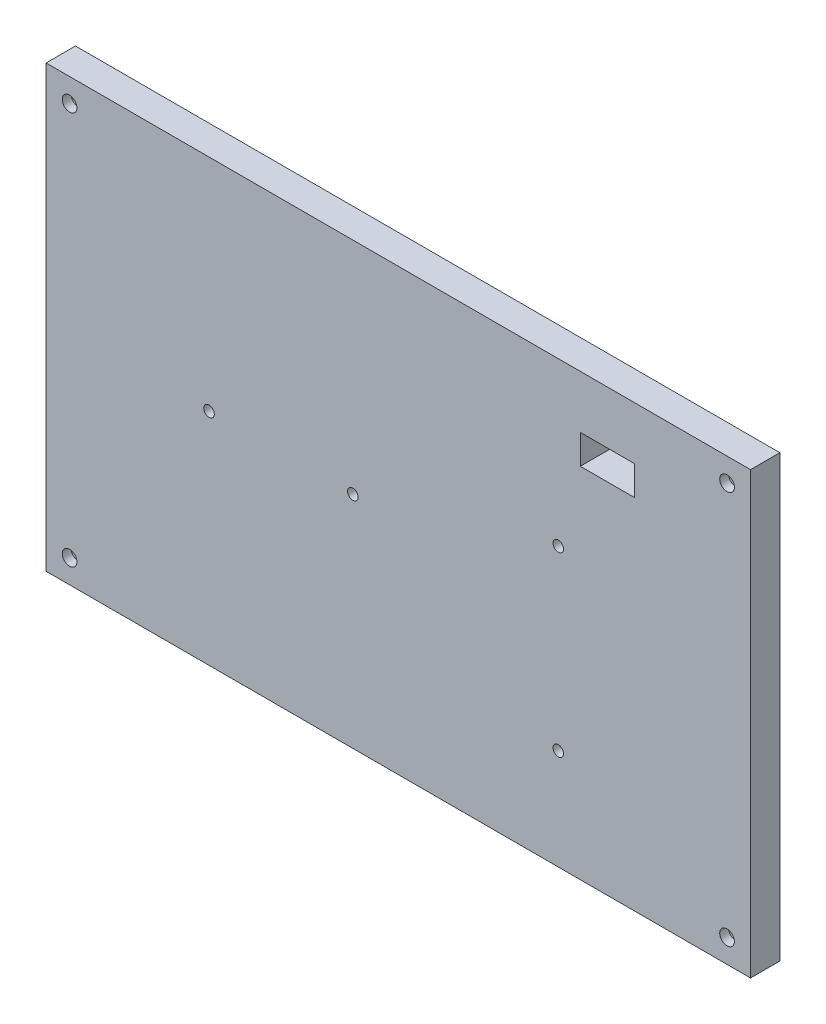
ISO-10303-21;
HEADER;
FILE_DESCRIPTION(('STEP AP214'),'2;1');
FILE_NAME('part.step','',(''),(''),'','','');
FILE_SCHEMA(('AUTOMOTIVE_DESIGN { 1 0 10303 214 1 1 1 1 }'));
ENDSEC;
DATA;
#1=APPLICATION_CONTEXT('core data for automotive mechanical design processes');
#2=APPLICATION_PROTOCOL_DEFINITION('international standard','automotive_design',2000,#1);
#3=PRODUCT_CONTEXT('',#1,'mechanical');
#4=PRODUCT('Part','Part','',(#3));
#5=PRODUCT_RELATED_PRODUCT_CATEGORY('part','',(#4));
#6=PRODUCT_DEFINITION_FORMATION('','',#4);
#7=PRODUCT_DEFINITION_CONTEXT('part definition',#1,'design');
#8=PRODUCT_DEFINITION('design','',#6,#7);
#9=PRODUCT_DEFINITION_SHAPE('','',#8);
#10=(LENGTH_UNIT() NAMED_UNIT(*) SI_UNIT(.MILLI.,.METRE.));
#11=(NAMED_UNIT(*) PLANE_ANGLE_UNIT() SI_UNIT($,.RADIAN.));
#12=(NAMED_UNIT(*) SI_UNIT($,.STERADIAN.) SOLID_ANGLE_UNIT());
#13=UNCERTAINTY_MEASURE_WITH_UNIT(LENGTH_MEASURE(1.E-05),#10,'distance_accuracy_value','');
#14=(GEOMETRIC_REPRESENTATION_CONTEXT(3) GLOBAL_UNCERTAINTY_ASSIGNED_CONTEXT((#13)) GLOBAL_UNIT_ASSIGNED_CONTEXT((#10,
#11,#12)) REPRESENTATION_CONTEXT('',''));
#15=CARTESIAN_POINT('',(0.,0.,0.));
#16=DIRECTION('',(0.,0.,1.));
#17=DIRECTION('',(1.,0.,0.));
#18=AXIS2_PLACEMENT_3D('',#15,#16,#17);
#19=CARTESIAN_POINT('',(-3.99999999999999,-33.5,5.));
#20=DIRECTION('',(0.,0.,-1.));
#21=DIRECTION('',(-1.,0.,0.));
#22=AXIS2_PLACEMENT_3D('',#19,#20,#21);
#23=CYLINDRICAL_SURFACE('',#22,1.25);
#24=CARTESIAN_POINT('',(-3.99999999999999,-33.5,5.));
#25=DIRECTION('',(0.,0.,-1.));
#26=DIRECTION('',(-1.,0.,0.));
#27=AXIS2_PLACEMENT_3D('',#24,#25,#26);
#28=CIRCLE('',#27,1.25);
#29=CARTESIAN_POINT('',(-5.24999999999999,-33.5,5.));
#30=VERTEX_POINT('',#29);
#31=EDGE_CURVE('E174',#30,#30,#28,.T.);
#32=ORIENTED_EDGE('',*,*,#31,.F.);
#33=EDGE_LOOP('',(#32));
#34=FACE_BOUND('',#33,.T.);
#35=CARTESIAN_POINT('',(-3.99999999999999,-33.5,3.5));
#36=DIRECTION('',(0.,0.,-1.));
#37=DIRECTION('',(-1.,0.,0.));
#38=AXIS2_PLACEMENT_3D('',#35,#36,#37);
#39=CIRCLE('',#38,1.25);
#40=CARTESIAN_POINT('',(-5.24999999999999,-33.5,3.5));
#41=VERTEX_POINT('',#40);
#42=EDGE_CURVE('E43',#41,#41,#39,.F.);
#43=ORIENTED_EDGE('',*,*,#42,.F.);
#44=EDGE_LOOP('',(#43));
#45=FACE_BOUND('',#44,.T.);
#46=ADVANCED_FACE('F39',(#34,#45),#23,.F.);
#47=CARTESIAN_POINT('',(-116.,-33.5,5.));
#48=DIRECTION('',(0.,0.,-1.));
#49=DIRECTION('',(-1.,0.,0.));
#50=AXIS2_PLACEMENT_3D('',#47,#48,#49);
#51=CYLINDRICAL_SURFACE('',#50,1.25);
#52=CARTESIAN_POINT('',(-116.,-33.5,5.));
#53=DIRECTION('',(0.,0.,-1.));
#54=DIRECTION('',(-1.,0.,0.));
#55=AXIS2_PLACEMENT_3D('',#52,#53,#54);
#56=CIRCLE('',#55,1.25);
#57=CARTESIAN_POINT('',(-117.25,-33.5,5.));
#58=VERTEX_POINT('',#57);
#59=EDGE_CURVE('E171',#58,#58,#56,.T.);
#60=ORIENTED_EDGE('',*,*,#59,.F.);
#61=EDGE_LOOP('',(#60));
#62=FACE_BOUND('',#61,.T.);
#63=CARTESIAN_POINT('',(-116.,-33.5,3.5));
#64=DIRECTION('',(0.,0.,-1.));
#65=DIRECTION('',(-1.,0.,0.));
#66=AXIS2_PLACEMENT_3D('',#63,#64,#65);
#67=CIRCLE('',#66,1.25);
#68=CARTESIAN_POINT('',(-117.25,-33.5,3.5));
#69=VERTEX_POINT('',#68);
#70=EDGE_CURVE('E215',#69,#69,#67,.F.);
#71=ORIENTED_EDGE('',*,*,#70,.F.);
#72=EDGE_LOOP('',(#71));
#73=FACE_BOUND('',#72,.T.);
#74=ADVANCED_FACE('F225',(#62,#73),#51,.F.);
#75=CARTESIAN_POINT('',(-116.,33.5,5.));
#76=DIRECTION('',(0.,0.,-1.));
#77=DIRECTION('',(-1.,0.,0.));
#78=AXIS2_PLACEMENT_3D('',#75,#76,#77);
#79=CYLINDRICAL_SURFACE('',#78,1.25);
#80=CARTESIAN_POINT('',(-116.,33.5,5.));
#81=DIRECTION('',(0.,0.,-1.));
#82=DIRECTION('',(-1.,0.,0.));
#83=AXIS2_PLACEMENT_3D('',#80,#81,#82);
#84=CIRCLE('',#83,1.25);
#85=CARTESIAN_POINT('',(-117.25,33.5,5.));
#86=VERTEX_POINT('',#85);
#87=EDGE_CURVE('E175',#86,#86,#84,.T.);
#88=ORIENTED_EDGE('',*,*,#87,.F.);
#89=EDGE_LOOP('',(#88));
#90=FACE_BOUND('',#89,.T.);
#91=CARTESIAN_POINT('',(-116.,33.5,3.5));
#92=DIRECTION('',(0.,0.,-1.));
#93=DIRECTION('',(-1.,0.,0.));
#94=AXIS2_PLACEMENT_3D('',#91,#92,#93);
#95=CIRCLE('',#94,1.25);
#96=CARTESIAN_POINT('',(-117.25,33.5,3.5));
#97=VERTEX_POINT('',#96);
#98=EDGE_CURVE('E213',#97,#97,#95,.F.);
#99=ORIENTED_EDGE('',*,*,#98,.F.);
#100=EDGE_LOOP('',(#99));
#101=FACE_BOUND('',#100,.T.);
#102=ADVANCED_FACE('F231',(#90,#101),#79,.F.);
#103=CARTESIAN_POINT('',(-3.99999999999999,33.5,5.));
#104=DIRECTION('',(0.,0.,-1.));
#105=DIRECTION('',(-1.,0.,0.));
#106=AXIS2_PLACEMENT_3D('',#103,#104,#105);
#107=CYLINDRICAL_SURFACE('',#106,1.25);
#108=CARTESIAN_POINT('',(-3.99999999999999,33.5,5.));
#109=DIRECTION('',(0.,0.,-1.));
#110=DIRECTION('',(-1.,0.,0.));
#111=AXIS2_PLACEMENT_3D('',#108,#109,#110);
#112=CIRCLE('',#111,1.25);
#113=CARTESIAN_POINT('',(-5.24999999999999,33.5,5.));
#114=VERTEX_POINT('',#113);
#115=EDGE_CURVE('E178',#114,#114,#112,.T.);
#116=ORIENTED_EDGE('',*,*,#115,.F.);
#117=EDGE_LOOP('',(#116));
#118=FACE_BOUND('',#117,.T.);
#119=CARTESIAN_POINT('',(-3.99999999999999,33.5,3.5));
#120=DIRECTION('',(0.,0.,-1.));
#121=DIRECTION('',(-1.,0.,0.));
#122=AXIS2_PLACEMENT_3D('',#119,#120,#121);
#123=CIRCLE('',#122,1.25);
#124=CARTESIAN_POINT('',(-5.24999999999999,33.5,3.5));
#125=VERTEX_POINT('',#124);
#126=EDGE_CURVE('E168',#125,#125,#123,.F.);
#127=ORIENTED_EDGE('',*,*,#126,.F.);
#128=EDGE_LOOP('',(#127));
#129=FACE_BOUND('',#128,.T.);
#130=ADVANCED_FACE('F237',(#118,#129),#107,.F.);
#131=CARTESIAN_POINT('',(-120.,37.5,5.));
#132=DIRECTION('',(1.,0.,0.));
#133=DIRECTION('',(0.,0.,-1.));
#134=AXIS2_PLACEMENT_3D('',#131,#132,#133);
#135=PLANE('',#134);
#136=DIRECTION('',(0.,-1.,0.));
#137=VECTOR('',#136,1.);
#138=CARTESIAN_POINT('',(-120.,37.5,0.));
#139=LINE('',#138,#137);
#140=CARTESIAN_POINT('',(-120.,37.5,0.));
#141=VERTEX_POINT('',#140);
#142=CARTESIAN_POINT('',(-120.,-37.5,0.));
#143=VERTEX_POINT('',#142);
#144=EDGE_CURVE('E183',#141,#143,#139,.T.);
#145=ORIENTED_EDGE('',*,*,#144,.T.);
#146=DIRECTION('',(0.,0.,-1.));
#147=VECTOR('',#146,1.);
#148=CARTESIAN_POINT('',(-120.,-37.5,5.));
#149=LINE('',#148,#147);
#150=CARTESIAN_POINT('',(-120.,-37.5,5.));
#151=VERTEX_POINT('',#150);
#152=EDGE_CURVE('E11',#151,#143,#149,.T.);
#153=ORIENTED_EDGE('',*,*,#152,.F.);
#154=DIRECTION('',(0.,-1.,0.));
#155=VECTOR('',#154,1.);
#156=CARTESIAN_POINT('',(-120.,37.5,5.));
#157=LINE('',#156,#155);
#158=CARTESIAN_POINT('',(-120.,37.5,5.));
#159=VERTEX_POINT('',#158);
#160=EDGE_CURVE('E184',#159,#151,#157,.T.);
#161=ORIENTED_EDGE('',*,*,#160,.F.);
#162=DIRECTION('',(0.,0.,-1.));
#163=VECTOR('',#162,1.);
#164=CARTESIAN_POINT('',(-120.,37.5,5.));
#165=LINE('',#164,#163);
#166=EDGE_CURVE('E196',#159,#141,#165,.T.);
#167=ORIENTED_EDGE('',*,*,#166,.T.);
#168=EDGE_LOOP('',(#145,#153,#161,#167));
#169=FACE_BOUND('',#168,.T.);
#170=ADVANCED_FACE('F41',(#169),#135,.F.);
#171=CARTESIAN_POINT('',(-120.,-37.5,5.));
#172=DIRECTION('',(0.,1.,0.));
#173=DIRECTION('',(0.,0.,1.));
#174=AXIS2_PLACEMENT_3D('',#171,#172,#173);
#175=PLANE('',#174);
#176=DIRECTION('',(1.,0.,0.));
#177=VECTOR('',#176,1.);
#178=CARTESIAN_POINT('',(-120.,-37.5,0.));
#179=LINE('',#178,#177);
#180=CARTESIAN_POINT('',(0.,-37.5,0.));
#181=VERTEX_POINT('',#180);
#182=EDGE_CURVE('E199',#143,#181,#179,.T.);
#183=ORIENTED_EDGE('',*,*,#182,.T.);
#184=DIRECTION('',(0.,0.,-1.));
#185=VECTOR('',#184,1.);
#186=CARTESIAN_POINT('',(0.,-37.5,5.));
#187=LINE('',#186,#185);
#188=CARTESIAN_POINT('',(0.,-37.5,5.));
#189=VERTEX_POINT('',#188);
#190=EDGE_CURVE('E48',#189,#181,#187,.T.);
#191=ORIENTED_EDGE('',*,*,#190,.F.);
#192=DIRECTION('',(1.,0.,0.));
#193=VECTOR('',#192,1.);
#194=CARTESIAN_POINT('',(-120.,-37.5,5.));
#195=LINE('',#194,#193);
#196=EDGE_CURVE('E187',#151,#189,#195,.T.);
#197=ORIENTED_EDGE('',*,*,#196,.F.);
#198=ORIENTED_EDGE('',*,*,#152,.T.);
#199=EDGE_LOOP('',(#183,#191,#197,#198));
#200=FACE_BOUND('',#199,.T.);
#201=ADVANCED_FACE('F253',(#200),#175,.F.);
#202=CARTESIAN_POINT('',(0.,37.5,5.));
#203=DIRECTION('',(1.,0.,0.));
#204=DIRECTION('',(0.,0.,-1.));
#205=AXIS2_PLACEMENT_3D('',#202,#203,#204);
#206=PLANE('',#205);
#207=DIRECTION('',(0.,-1.,0.));
#208=VECTOR('',#207,1.);
#209=CARTESIAN_POINT('',(0.,37.5,0.));
#210=LINE('',#209,#208);
#211=CARTESIAN_POINT('',(0.,37.5,0.));
#212=VERTEX_POINT('',#211);
#213=EDGE_CURVE('E202',#212,#181,#210,.T.);
#214=ORIENTED_EDGE('',*,*,#213,.F.);
#215=DIRECTION('',(0.,0.,-1.));
#216=VECTOR('',#215,1.);
#217=CARTESIAN_POINT('',(0.,37.5,5.));
#218=LINE('',#217,#216);
#219=CARTESIAN_POINT('',(0.,37.5,5.));
#220=VERTEX_POINT('',#219);
#221=EDGE_CURVE('E208',#220,#212,#218,.T.);
#222=ORIENTED_EDGE('',*,*,#221,.F.);
#223=DIRECTION('',(0.,-1.,0.));
#224=VECTOR('',#223,1.);
#225=CARTESIAN_POINT('',(0.,37.5,5.));
#226=LINE('',#225,#224);
#227=EDGE_CURVE('E190',#220,#189,#226,.T.);
#228=ORIENTED_EDGE('',*,*,#227,.T.);
#229=ORIENTED_EDGE('',*,*,#190,.T.);
#230=EDGE_LOOP('',(#214,#222,#228,#229));
#231=FACE_BOUND('',#230,.T.);
#232=ADVANCED_FACE('F250',(#231),#206,.T.);
#233=CARTESIAN_POINT('',(-120.,37.5,5.));
#234=DIRECTION('',(0.,1.,0.));
#235=DIRECTION('',(0.,0.,1.));
#236=AXIS2_PLACEMENT_3D('',#233,#234,#235);
#237=PLANE('',#236);
#238=DIRECTION('',(1.,0.,0.));
#239=VECTOR('',#238,1.);
#240=CARTESIAN_POINT('',(-120.,37.5,0.));
#241=LINE('',#240,#239);
#242=EDGE_CURVE('E188',#141,#212,#241,.T.);
#243=ORIENTED_EDGE('',*,*,#242,.F.);
#244=ORIENTED_EDGE('',*,*,#166,.F.);
#245=DIRECTION('',(1.,0.,0.));
#246=VECTOR('',#245,1.);
#247=CARTESIAN_POINT('',(-120.,37.5,5.));
#248=LINE('',#247,#246);
#249=EDGE_CURVE('E193',#159,#220,#248,.T.);
#250=ORIENTED_EDGE('',*,*,#249,.T.);
#251=ORIENTED_EDGE('',*,*,#221,.T.);
#252=EDGE_LOOP('',(#243,#244,#250,#251));
#253=FACE_BOUND('',#252,.T.);
#254=ADVANCED_FACE('F242',(#253),#237,.T.);
#255=CARTESIAN_POINT('',(0.,0.,5.));
#256=DIRECTION('',(0.,0.,1.));
#257=DIRECTION('',(1.,0.,0.));
#258=AXIS2_PLACEMENT_3D('',#255,#256,#257);
#259=PLANE('',#258);
#260=CARTESIAN_POINT('',(-32.75,9.84999999999999,5.));
#261=DIRECTION('',(0.,0.,1.));
#262=DIRECTION('',(1.,0.,0.));
#263=AXIS2_PLACEMENT_3D('',#260,#261,#262);
#264=CIRCLE('',#263,0.899999999999997);
#265=CARTESIAN_POINT('',(-31.85,9.84999999999999,5.));
#266=VERTEX_POINT('',#265);
#267=EDGE_CURVE('E350',#266,#266,#264,.T.);
#268=ORIENTED_EDGE('',*,*,#267,.F.);
#269=EDGE_LOOP('',(#268));
#270=FACE_BOUND('',#269,.T.);
#271=CARTESIAN_POINT('',(-32.75,-20.35,5.));
#272=DIRECTION('',(0.,0.,1.));
#273=DIRECTION('',(1.,0.,0.));
#274=AXIS2_PLACEMENT_3D('',#271,#272,#273);
#275=CIRCLE('',#274,0.899999999999996);
#276=CARTESIAN_POINT('',(-31.85,-20.35,5.));
#277=VERTEX_POINT('',#276);
#278=EDGE_CURVE('E351',#277,#277,#275,.T.);
#279=ORIENTED_EDGE('',*,*,#278,.F.);
#280=EDGE_LOOP('',(#279));
#281=FACE_BOUND('',#280,.T.);
#282=CARTESIAN_POINT('',(-92.25,0.,5.));
#283=DIRECTION('',(0.,0.,1.));
#284=DIRECTION('',(1.,0.,0.));
#285=AXIS2_PLACEMENT_3D('',#282,#283,#284);
#286=CIRCLE('',#285,0.900000000000003);
#287=CARTESIAN_POINT('',(-91.35,0.,5.));
#288=VERTEX_POINT('',#287);
#289=EDGE_CURVE('E362',#288,#288,#286,.T.);
#290=ORIENTED_EDGE('',*,*,#289,.F.);
#291=EDGE_LOOP('',(#290));
#292=FACE_BOUND('',#291,.T.);
#293=CARTESIAN_POINT('',(-67.75,0.,5.));
#294=DIRECTION('',(0.,0.,1.));
#295=DIRECTION('',(1.,0.,0.));
#296=AXIS2_PLACEMENT_3D('',#293,#294,#295);
#297=CIRCLE('',#296,0.900000000000003);
#298=CARTESIAN_POINT('',(-66.85,0.,5.));
#299=VERTEX_POINT('',#298);
#300=EDGE_CURVE('E364',#299,#299,#297,.T.);
#301=ORIENTED_EDGE('',*,*,#300,.F.);
#302=EDGE_LOOP('',(#301));
#303=FACE_BOUND('',#302,.T.);
#304=DIRECTION('',(0.,-1.,0.));
#305=VECTOR('',#304,1.);
#306=CARTESIAN_POINT('',(-19.8,28.5,5.));
#307=LINE('',#306,#305);
#308=CARTESIAN_POINT('',(-19.8,28.5,5.));
#309=VERTEX_POINT('',#308);
#310=CARTESIAN_POINT('',(-19.8,23.5,5.));
#311=VERTEX_POINT('',#310);
#312=EDGE_CURVE('E108',#309,#311,#307,.T.);
#313=ORIENTED_EDGE('',*,*,#312,.T.);
#314=DIRECTION('',(-1.,0.,0.));
#315=VECTOR('',#314,1.);
#316=CARTESIAN_POINT('',(-19.8,23.5,5.));
#317=LINE('',#316,#315);
#318=CARTESIAN_POINT('',(-29.,23.5,5.));
#319=VERTEX_POINT('',#318);
#320=EDGE_CURVE('E117',#311,#319,#317,.T.);
#321=ORIENTED_EDGE('',*,*,#320,.T.);
#322=DIRECTION('',(0.,1.,0.));
#323=VECTOR('',#322,1.);
#324=CARTESIAN_POINT('',(-29.,28.5,5.));
#325=LINE('',#324,#323);
#326=CARTESIAN_POINT('',(-29.,28.5,5.));
#327=VERTEX_POINT('',#326);
#328=EDGE_CURVE('E56',#319,#327,#325,.T.);
#329=ORIENTED_EDGE('',*,*,#328,.T.);
#330=DIRECTION('',(1.,0.,0.));
#331=VECTOR('',#330,1.);
#332=CARTESIAN_POINT('',(-19.8,28.5,5.));
#333=LINE('',#332,#331);
#334=EDGE_CURVE('E114',#327,#309,#333,.T.);
#335=ORIENTED_EDGE('',*,*,#334,.T.);
#336=EDGE_LOOP('',(#313,#321,#329,#335));
#337=FACE_BOUND('',#336,.T.);
#338=ORIENTED_EDGE('',*,*,#115,.T.);
#339=EDGE_LOOP('',(#338));
#340=FACE_BOUND('',#339,.T.);
#341=ORIENTED_EDGE('',*,*,#87,.T.);
#342=EDGE_LOOP('',(#341));
#343=FACE_BOUND('',#342,.T.);
#344=ORIENTED_EDGE('',*,*,#59,.T.);
#345=EDGE_LOOP('',(#344));
#346=FACE_BOUND('',#345,.T.);
#347=ORIENTED_EDGE('',*,*,#31,.T.);
#348=EDGE_LOOP('',(#347));
#349=FACE_BOUND('',#348,.T.);
#350=ORIENTED_EDGE('',*,*,#160,.T.);
#351=ORIENTED_EDGE('',*,*,#196,.T.);
#352=ORIENTED_EDGE('',*,*,#227,.F.);
#353=ORIENTED_EDGE('',*,*,#249,.F.);
#354=EDGE_LOOP('',(#350,#351,#352,#353));
#355=FACE_BOUND('',#354,.T.);
#356=ADVANCED_FACE('F121',(#270,#281,#292,#303,#337,#340,#343,#346,#349,#355),#259,.T.);
#357=CARTESIAN_POINT('',(0.,0.,0.));
#358=DIRECTION('',(0.,0.,1.));
#359=DIRECTION('',(1.,0.,0.));
#360=AXIS2_PLACEMENT_3D('',#357,#358,#359);
#361=PLANE('',#360);
#362=CARTESIAN_POINT('',(-32.75,9.84999999999999,0.));
#363=DIRECTION('',(0.,0.,1.));
#364=DIRECTION('',(1.,0.,0.));
#365=AXIS2_PLACEMENT_3D('',#362,#363,#364);
#366=CIRCLE('',#365,0.899999999999997);
#367=CARTESIAN_POINT('',(-31.85,9.84999999999999,0.));
#368=VERTEX_POINT('',#367);
#369=EDGE_CURVE('E347',#368,#368,#366,.T.);
#370=ORIENTED_EDGE('',*,*,#369,.T.);
#371=EDGE_LOOP('',(#370));
#372=FACE_BOUND('',#371,.T.);
#373=CARTESIAN_POINT('',(-32.75,-20.35,0.));
#374=DIRECTION('',(0.,0.,1.));
#375=DIRECTION('',(1.,0.,0.));
#376=AXIS2_PLACEMENT_3D('',#373,#374,#375);
#377=CIRCLE('',#376,0.899999999999996);
#378=CARTESIAN_POINT('',(-31.85,-20.35,0.));
#379=VERTEX_POINT('',#378);
#380=EDGE_CURVE('E355',#379,#379,#377,.T.);
#381=ORIENTED_EDGE('',*,*,#380,.T.);
#382=EDGE_LOOP('',(#381));
#383=FACE_BOUND('',#382,.T.);
#384=CARTESIAN_POINT('',(-92.25,0.,0.));
#385=DIRECTION('',(0.,0.,1.));
#386=DIRECTION('',(1.,0.,0.));
#387=AXIS2_PLACEMENT_3D('',#384,#385,#386);
#388=CIRCLE('',#387,0.900000000000003);
#389=CARTESIAN_POINT('',(-91.35,0.,0.));
#390=VERTEX_POINT('',#389);
#391=EDGE_CURVE('E137',#390,#390,#388,.T.);
#392=ORIENTED_EDGE('',*,*,#391,.T.);
#393=EDGE_LOOP('',(#392));
#394=FACE_BOUND('',#393,.T.);
#395=CARTESIAN_POINT('',(-67.75,0.,0.));
#396=DIRECTION('',(0.,0.,1.));
#397=DIRECTION('',(1.,0.,0.));
#398=AXIS2_PLACEMENT_3D('',#395,#396,#397);
#399=CIRCLE('',#398,0.900000000000003);
#400=CARTESIAN_POINT('',(-66.85,0.,0.));
#401=VERTEX_POINT('',#400);
#402=EDGE_CURVE('E130',#401,#401,#399,.T.);
#403=ORIENTED_EDGE('',*,*,#402,.T.);
#404=EDGE_LOOP('',(#403));
#405=FACE_BOUND('',#404,.T.);
#406=DIRECTION('',(-1.,0.,0.));
#407=VECTOR('',#406,1.);
#408=CARTESIAN_POINT('',(-19.8,23.5,0.));
#409=LINE('',#408,#407);
#410=CARTESIAN_POINT('',(-19.8,23.5,0.));
#411=VERTEX_POINT('',#410);
#412=CARTESIAN_POINT('',(-29.,23.5,0.));
#413=VERTEX_POINT('',#412);
#414=EDGE_CURVE('E136',#411,#413,#409,.T.);
#415=ORIENTED_EDGE('',*,*,#414,.F.);
#416=DIRECTION('',(0.,-1.,0.));
#417=VECTOR('',#416,1.);
#418=CARTESIAN_POINT('',(-19.8,28.5,0.));
#419=LINE('',#418,#417);
#420=CARTESIAN_POINT('',(-19.8,28.5,0.));
#421=VERTEX_POINT('',#420);
#422=EDGE_CURVE('E64',#421,#411,#419,.T.);
#423=ORIENTED_EDGE('',*,*,#422,.F.);
#424=DIRECTION('',(1.,0.,0.));
#425=VECTOR('',#424,1.);
#426=CARTESIAN_POINT('',(-19.8,28.5,0.));
#427=LINE('',#426,#425);
#428=CARTESIAN_POINT('',(-29.,28.5,0.));
#429=VERTEX_POINT('',#428);
#430=EDGE_CURVE('E124',#429,#421,#427,.T.);
#431=ORIENTED_EDGE('',*,*,#430,.F.);
#432=DIRECTION('',(0.,1.,0.));
#433=VECTOR('',#432,1.);
#434=CARTESIAN_POINT('',(-29.,28.5,0.));
#435=LINE('',#434,#433);
#436=EDGE_CURVE('E127',#413,#429,#435,.T.);
#437=ORIENTED_EDGE('',*,*,#436,.F.);
#438=EDGE_LOOP('',(#415,#423,#431,#437));
#439=FACE_BOUND('',#438,.T.);
#440=CARTESIAN_POINT('',(-3.99999999999999,-33.5,0.));
#441=DIRECTION('',(0.,0.,-1.));
#442=DIRECTION('',(-1.,0.,0.));
#443=AXIS2_PLACEMENT_3D('',#440,#441,#442);
#444=CIRCLE('',#443,2.);
#445=CARTESIAN_POINT('',(-5.99999999999999,-33.5,0.));
#446=VERTEX_POINT('',#445);
#447=EDGE_CURVE('E160',#446,#446,#444,.T.);
#448=ORIENTED_EDGE('',*,*,#447,.F.);
#449=EDGE_LOOP('',(#448));
#450=FACE_BOUND('',#449,.T.);
#451=CARTESIAN_POINT('',(-116.,-33.5,0.));
#452=DIRECTION('',(0.,0.,-1.));
#453=DIRECTION('',(-1.,0.,0.));
#454=AXIS2_PLACEMENT_3D('',#451,#452,#453);
#455=CIRCLE('',#454,2.);
#456=CARTESIAN_POINT('',(-118.,-33.5,0.));
#457=VERTEX_POINT('',#456);
#458=EDGE_CURVE('E154',#457,#457,#455,.T.);
#459=ORIENTED_EDGE('',*,*,#458,.F.);
#460=EDGE_LOOP('',(#459));
#461=FACE_BOUND('',#460,.T.);
#462=CARTESIAN_POINT('',(-116.,33.5,0.));
#463=DIRECTION('',(0.,0.,-1.));
#464=DIRECTION('',(-1.,0.,0.));
#465=AXIS2_PLACEMENT_3D('',#462,#463,#464);
#466=CIRCLE('',#465,2.);
#467=CARTESIAN_POINT('',(-118.,33.5,0.));
#468=VERTEX_POINT('',#467);
#469=EDGE_CURVE('E147',#468,#468,#466,.T.);
#470=ORIENTED_EDGE('',*,*,#469,.F.);
#471=EDGE_LOOP('',(#470));
#472=FACE_BOUND('',#471,.T.);
#473=CARTESIAN_POINT('',(-3.99999999999999,33.5,0.));
#474=DIRECTION('',(0.,0.,-1.));
#475=DIRECTION('',(-1.,0.,0.));
#476=AXIS2_PLACEMENT_3D('',#473,#474,#475);
#477=CIRCLE('',#476,2.);
#478=CARTESIAN_POINT('',(-5.99999999999999,33.5,0.));
#479=VERTEX_POINT('',#478);
#480=EDGE_CURVE('E150',#479,#479,#477,.T.);
#481=ORIENTED_EDGE('',*,*,#480,.F.);
#482=EDGE_LOOP('',(#481));
#483=FACE_BOUND('',#482,.T.);
#484=ORIENTED_EDGE('',*,*,#144,.F.);
#485=ORIENTED_EDGE('',*,*,#242,.T.);
#486=ORIENTED_EDGE('',*,*,#213,.T.);
#487=ORIENTED_EDGE('',*,*,#182,.F.);
#488=EDGE_LOOP('',(#484,#485,#486,#487));
#489=FACE_BOUND('',#488,.T.);
#490=ADVANCED_FACE('F241',(#372,#383,#394,#405,#439,#450,#461,#472,#483,#489),#361,.F.);
#491=CARTESIAN_POINT('',(-3.99999999999999,33.5,3.5));
#492=DIRECTION('',(0.,0.,-1.));
#493=DIRECTION('',(-1.,0.,0.));
#494=AXIS2_PLACEMENT_3D('',#491,#492,#493);
#495=PLANE('',#494);
#496=CARTESIAN_POINT('',(-3.99999999999999,33.5,3.5));
#497=DIRECTION('',(0.,0.,-1.));
#498=DIRECTION('',(-1.,0.,0.));
#499=AXIS2_PLACEMENT_3D('',#496,#497,#498);
#500=CIRCLE('',#499,2.);
#501=CARTESIAN_POINT('',(-5.99999999999999,33.5,3.5));
#502=VERTEX_POINT('',#501);
#503=EDGE_CURVE('E165',#502,#502,#500,.T.);
#504=ORIENTED_EDGE('',*,*,#503,.T.);
#505=EDGE_LOOP('',(#504));
#506=FACE_BOUND('',#505,.T.);
#507=ORIENTED_EDGE('',*,*,#126,.T.);
#508=EDGE_LOOP('',(#507));
#509=FACE_BOUND('',#508,.T.);
#510=ADVANCED_FACE('F246',(#506,#509),#495,.T.);
#511=CARTESIAN_POINT('',(-3.99999999999999,33.5,3.5));
#512=DIRECTION('',(0.,0.,-1.));
#513=DIRECTION('',(-1.,0.,0.));
#514=AXIS2_PLACEMENT_3D('',#511,#512,#513);
#515=CYLINDRICAL_SURFACE('',#514,2.);
#516=ORIENTED_EDGE('',*,*,#503,.F.);
#517=EDGE_LOOP('',(#516));
#518=FACE_BOUND('',#517,.T.);
#519=ORIENTED_EDGE('',*,*,#480,.T.);
#520=EDGE_LOOP('',(#519));
#521=FACE_BOUND('',#520,.T.);
#522=ADVANCED_FACE('F284',(#518,#521),#515,.F.);
#523=CARTESIAN_POINT('',(-116.,33.5,3.5));
#524=DIRECTION('',(0.,0.,-1.));
#525=DIRECTION('',(-1.,0.,0.));
#526=AXIS2_PLACEMENT_3D('',#523,#524,#525);
#527=PLANE('',#526);
#528=CARTESIAN_POINT('',(-116.,33.5,3.5));
#529=DIRECTION('',(0.,0.,-1.));
#530=DIRECTION('',(-1.,0.,0.));
#531=AXIS2_PLACEMENT_3D('',#528,#529,#530);
#532=CIRCLE('',#531,2.);
#533=CARTESIAN_POINT('',(-118.,33.5,3.5));
#534=VERTEX_POINT('',#533);
#535=EDGE_CURVE('E151',#534,#534,#532,.T.);
#536=ORIENTED_EDGE('',*,*,#535,.T.);
#537=EDGE_LOOP('',(#536));
#538=FACE_BOUND('',#537,.T.);
#539=ORIENTED_EDGE('',*,*,#98,.T.);
#540=EDGE_LOOP('',(#539));
#541=FACE_BOUND('',#540,.T.);
#542=ADVANCED_FACE('F290',(#538,#541),#527,.T.);
#543=CARTESIAN_POINT('',(-116.,33.5,3.5));
#544=DIRECTION('',(0.,0.,-1.));
#545=DIRECTION('',(-1.,0.,0.));
#546=AXIS2_PLACEMENT_3D('',#543,#544,#545);
#547=CYLINDRICAL_SURFACE('',#546,2.);
#548=ORIENTED_EDGE('',*,*,#535,.F.);
#549=EDGE_LOOP('',(#548));
#550=FACE_BOUND('',#549,.T.);
#551=ORIENTED_EDGE('',*,*,#469,.T.);
#552=EDGE_LOOP('',(#551));
#553=FACE_BOUND('',#552,.T.);
#554=ADVANCED_FACE('F305',(#550,#553),#547,.F.);
#555=CARTESIAN_POINT('',(-116.,-33.5,3.5));
#556=DIRECTION('',(0.,0.,-1.));
#557=DIRECTION('',(-1.,0.,0.));
#558=AXIS2_PLACEMENT_3D('',#555,#556,#557);
#559=PLANE('',#558);
#560=CARTESIAN_POINT('',(-116.,-33.5,3.5));
#561=DIRECTION('',(0.,0.,-1.));
#562=DIRECTION('',(-1.,0.,0.));
#563=AXIS2_PLACEMENT_3D('',#560,#561,#562);
#564=CIRCLE('',#563,2.);
#565=CARTESIAN_POINT('',(-118.,-33.5,3.5));
#566=VERTEX_POINT('',#565);
#567=EDGE_CURVE('E157',#566,#566,#564,.T.);
#568=ORIENTED_EDGE('',*,*,#567,.T.);
#569=EDGE_LOOP('',(#568));
#570=FACE_BOUND('',#569,.T.);
#571=ORIENTED_EDGE('',*,*,#70,.T.);
#572=EDGE_LOOP('',(#571));
#573=FACE_BOUND('',#572,.T.);
#574=ADVANCED_FACE('F302',(#570,#573),#559,.T.);
#575=CARTESIAN_POINT('',(-116.,-33.5,3.5));
#576=DIRECTION('',(0.,0.,-1.));
#577=DIRECTION('',(-1.,0.,0.));
#578=AXIS2_PLACEMENT_3D('',#575,#576,#577);
#579=CYLINDRICAL_SURFACE('',#578,2.);
#580=ORIENTED_EDGE('',*,*,#567,.F.);
#581=EDGE_LOOP('',(#580));
#582=FACE_BOUND('',#581,.T.);
#583=ORIENTED_EDGE('',*,*,#458,.T.);
#584=EDGE_LOOP('',(#583));
#585=FACE_BOUND('',#584,.T.);
#586=ADVANCED_FACE('F297',(#582,#585),#579,.F.);
#587=CARTESIAN_POINT('',(-3.99999999999999,-33.5,3.5));
#588=DIRECTION('',(0.,0.,-1.));
#589=DIRECTION('',(-1.,0.,0.));
#590=AXIS2_PLACEMENT_3D('',#587,#588,#589);
#591=PLANE('',#590);
#592=CARTESIAN_POINT('',(-3.99999999999999,-33.5,3.5));
#593=DIRECTION('',(0.,0.,-1.));
#594=DIRECTION('',(-1.,0.,0.));
#595=AXIS2_PLACEMENT_3D('',#592,#593,#594);
#596=CIRCLE('',#595,2.);
#597=CARTESIAN_POINT('',(-5.99999999999999,-33.5,3.5));
#598=VERTEX_POINT('',#597);
#599=EDGE_CURVE('E143',#598,#598,#596,.T.);
#600=ORIENTED_EDGE('',*,*,#599,.T.);
#601=EDGE_LOOP('',(#600));
#602=FACE_BOUND('',#601,.T.);
#603=ORIENTED_EDGE('',*,*,#42,.T.);
#604=EDGE_LOOP('',(#603));
#605=FACE_BOUND('',#604,.T.);
#606=ADVANCED_FACE('F222',(#602,#605),#591,.T.);
#607=CARTESIAN_POINT('',(-3.99999999999999,-33.5,3.5));
#608=DIRECTION('',(0.,0.,-1.));
#609=DIRECTION('',(-1.,0.,0.));
#610=AXIS2_PLACEMENT_3D('',#607,#608,#609);
#611=CYLINDRICAL_SURFACE('',#610,2.);
#612=ORIENTED_EDGE('',*,*,#599,.F.);
#613=EDGE_LOOP('',(#612));
#614=FACE_BOUND('',#613,.T.);
#615=ORIENTED_EDGE('',*,*,#447,.T.);
#616=EDGE_LOOP('',(#615));
#617=FACE_BOUND('',#616,.T.);
#618=ADVANCED_FACE('F296',(#614,#617),#611,.F.);
#619=CARTESIAN_POINT('',(-19.8,28.5,5.));
#620=DIRECTION('',(1.,0.,0.));
#621=DIRECTION('',(0.,1.,0.));
#622=AXIS2_PLACEMENT_3D('',#619,#620,#621);
#623=PLANE('',#622);
#624=ORIENTED_EDGE('',*,*,#422,.T.);
#625=DIRECTION('',(0.,0.,-1.));
#626=VECTOR('',#625,1.);
#627=CARTESIAN_POINT('',(-19.8,23.5,5.));
#628=LINE('',#627,#626);
#629=EDGE_CURVE('E104',#311,#411,#628,.T.);
#630=ORIENTED_EDGE('',*,*,#629,.F.);
#631=ORIENTED_EDGE('',*,*,#312,.F.);
#632=DIRECTION('',(0.,0.,-1.));
#633=VECTOR('',#632,1.);
#634=CARTESIAN_POINT('',(-19.8,28.5,5.));
#635=LINE('',#634,#633);
#636=EDGE_CURVE('E141',#309,#421,#635,.T.);
#637=ORIENTED_EDGE('',*,*,#636,.T.);
#638=EDGE_LOOP('',(#624,#630,#631,#637));
#639=FACE_BOUND('',#638,.T.);
#640=ADVANCED_FACE('F106',(#639),#623,.F.);
#641=CARTESIAN_POINT('',(-19.8,28.5,5.));
#642=DIRECTION('',(0.,1.,0.));
#643=DIRECTION('',(0.,0.,1.));
#644=AXIS2_PLACEMENT_3D('',#641,#642,#643);
#645=PLANE('',#644);
#646=ORIENTED_EDGE('',*,*,#430,.T.);
#647=ORIENTED_EDGE('',*,*,#636,.F.);
#648=ORIENTED_EDGE('',*,*,#334,.F.);
#649=DIRECTION('',(0.,0.,-1.));
#650=VECTOR('',#649,1.);
#651=CARTESIAN_POINT('',(-29.,28.5,5.));
#652=LINE('',#651,#650);
#653=EDGE_CURVE('E144',#327,#429,#652,.T.);
#654=ORIENTED_EDGE('',*,*,#653,.T.);
#655=EDGE_LOOP('',(#646,#647,#648,#654));
#656=FACE_BOUND('',#655,.T.);
#657=ADVANCED_FACE('F318',(#656),#645,.F.);
#658=CARTESIAN_POINT('',(-29.,28.5,5.));
#659=DIRECTION('',(-1.,0.,0.));
#660=DIRECTION('',(0.,-1.,0.));
#661=AXIS2_PLACEMENT_3D('',#658,#659,#660);
#662=PLANE('',#661);
#663=ORIENTED_EDGE('',*,*,#436,.T.);
#664=ORIENTED_EDGE('',*,*,#653,.F.);
#665=ORIENTED_EDGE('',*,*,#328,.F.);
#666=DIRECTION('',(0.,0.,-1.));
#667=VECTOR('',#666,1.);
#668=CARTESIAN_POINT('',(-29.,23.5,5.));
#669=LINE('',#668,#667);
#670=EDGE_CURVE('E113',#319,#413,#669,.T.);
#671=ORIENTED_EDGE('',*,*,#670,.T.);
#672=EDGE_LOOP('',(#663,#664,#665,#671));
#673=FACE_BOUND('',#672,.T.);
#674=ADVANCED_FACE('F322',(#673),#662,.F.);
#675=CARTESIAN_POINT('',(-19.8,23.5,5.));
#676=DIRECTION('',(0.,-1.,0.));
#677=DIRECTION('',(0.,0.,-1.));
#678=AXIS2_PLACEMENT_3D('',#675,#676,#677);
#679=PLANE('',#678);
#680=ORIENTED_EDGE('',*,*,#414,.T.);
#681=ORIENTED_EDGE('',*,*,#670,.F.);
#682=ORIENTED_EDGE('',*,*,#320,.F.);
#683=ORIENTED_EDGE('',*,*,#629,.T.);
#684=EDGE_LOOP('',(#680,#681,#682,#683));
#685=FACE_BOUND('',#684,.T.);
#686=ADVANCED_FACE('F118',(#685),#679,.F.);
#687=CARTESIAN_POINT('',(-67.75,0.,0.));
#688=DIRECTION('',(0.,0.,1.));
#689=DIRECTION('',(1.,0.,0.));
#690=AXIS2_PLACEMENT_3D('',#687,#688,#689);
#691=CYLINDRICAL_SURFACE('',#690,0.900000000000003);
#692=ORIENTED_EDGE('',*,*,#402,.F.);
#693=EDGE_LOOP('',(#692));
#694=FACE_BOUND('',#693,.T.);
#695=ORIENTED_EDGE('',*,*,#300,.T.);
#696=EDGE_LOOP('',(#695));
#697=FACE_BOUND('',#696,.T.);
#698=ADVANCED_FACE('F321',(#694,#697),#691,.F.);
#699=CARTESIAN_POINT('',(-92.25,0.,0.));
#700=DIRECTION('',(0.,0.,1.));
#701=DIRECTION('',(1.,0.,0.));
#702=AXIS2_PLACEMENT_3D('',#699,#700,#701);
#703=CYLINDRICAL_SURFACE('',#702,0.900000000000003);
#704=ORIENTED_EDGE('',*,*,#391,.F.);
#705=EDGE_LOOP('',(#704));
#706=FACE_BOUND('',#705,.T.);
#707=ORIENTED_EDGE('',*,*,#289,.T.);
#708=EDGE_LOOP('',(#707));
#709=FACE_BOUND('',#708,.T.);
#710=ADVANCED_FACE('F330',(#706,#709),#703,.F.);
#711=CARTESIAN_POINT('',(-32.75,-20.35,0.));
#712=DIRECTION('',(0.,0.,1.));
#713=DIRECTION('',(1.,0.,0.));
#714=AXIS2_PLACEMENT_3D('',#711,#712,#713);
#715=CYLINDRICAL_SURFACE('',#714,0.899999999999996);
#716=ORIENTED_EDGE('',*,*,#380,.F.);
#717=EDGE_LOOP('',(#716));
#718=FACE_BOUND('',#717,.T.);
#719=ORIENTED_EDGE('',*,*,#278,.T.);
#720=EDGE_LOOP('',(#719));
#721=FACE_BOUND('',#720,.T.);
#722=ADVANCED_FACE('F334',(#718,#721),#715,.F.);
#723=CARTESIAN_POINT('',(-32.75,9.84999999999999,0.));
#724=DIRECTION('',(0.,0.,1.));
#725=DIRECTION('',(1.,0.,0.));
#726=AXIS2_PLACEMENT_3D('',#723,#724,#725);
#727=CYLINDRICAL_SURFACE('',#726,0.899999999999997);
#728=ORIENTED_EDGE('',*,*,#369,.F.);
#729=EDGE_LOOP('',(#728));
#730=FACE_BOUND('',#729,.T.);
#731=ORIENTED_EDGE('',*,*,#267,.T.);
#732=EDGE_LOOP('',(#731));
#733=FACE_BOUND('',#732,.T.);
#734=ADVANCED_FACE('F338',(#730,#733),#727,.F.);
#735=CLOSED_SHELL('',(#46,#74,#102,#130,#170,#201,#232,#254,#356,#490,#510,#522,#542,#554,#574,
#586,#606,#618,#640,#657,#674,#686,#698,#710,#722,#734));
#736=MANIFOLD_SOLID_BREP('B2',#735);
#737=ADVANCED_BREP_SHAPE_REPRESENTATION('',(#18,#736),#14);
#738=SHAPE_DEFINITION_REPRESENTATION(#9,#737);
ENDSEC;
END-ISO-10303-21;
